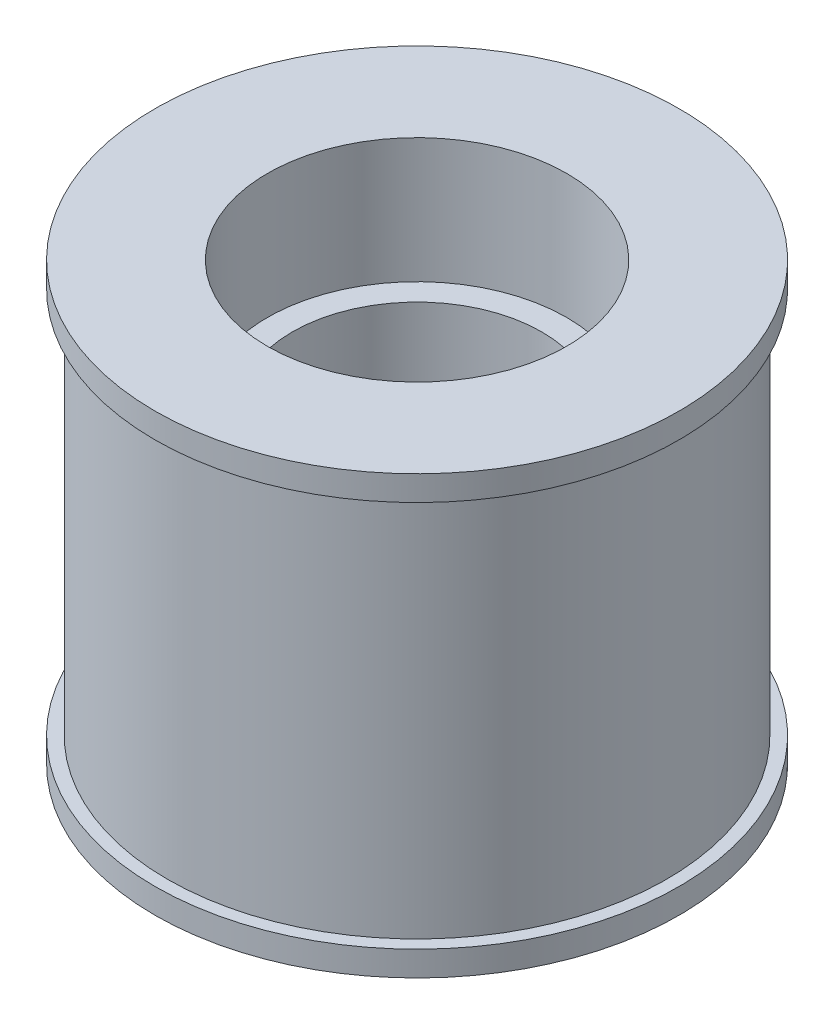
ISO-10303-21;
HEADER;
FILE_DESCRIPTION(('STEP AP214'),'2;1');
FILE_NAME('part.step','',(''),(''),'','','');
FILE_SCHEMA(('AUTOMOTIVE_DESIGN { 1 0 10303 214 1 1 1 1 }'));
ENDSEC;
DATA;
#1=APPLICATION_CONTEXT('core data for automotive mechanical design processes');
#2=APPLICATION_PROTOCOL_DEFINITION('international standard','automotive_design',2000,#1);
#3=PRODUCT_CONTEXT('',#1,'mechanical');
#4=PRODUCT('Part','Part','',(#3));
#5=PRODUCT_RELATED_PRODUCT_CATEGORY('part','',(#4));
#6=PRODUCT_DEFINITION_FORMATION('','',#4);
#7=PRODUCT_DEFINITION_CONTEXT('part definition',#1,'design');
#8=PRODUCT_DEFINITION('design','',#6,#7);
#9=PRODUCT_DEFINITION_SHAPE('','',#8);
#10=(LENGTH_UNIT() NAMED_UNIT(*) SI_UNIT(.MILLI.,.METRE.));
#11=(NAMED_UNIT(*) PLANE_ANGLE_UNIT() SI_UNIT($,.RADIAN.));
#12=(NAMED_UNIT(*) SI_UNIT($,.STERADIAN.) SOLID_ANGLE_UNIT());
#13=UNCERTAINTY_MEASURE_WITH_UNIT(LENGTH_MEASURE(1.E-05),#10,'distance_accuracy_value','');
#14=(GEOMETRIC_REPRESENTATION_CONTEXT(3) GLOBAL_UNCERTAINTY_ASSIGNED_CONTEXT((#13)) GLOBAL_UNIT_ASSIGNED_CONTEXT((#10,
#11,#12)) REPRESENTATION_CONTEXT('',''));
#15=CARTESIAN_POINT('',(0.,0.,0.));
#16=DIRECTION('',(0.,0.,1.));
#17=DIRECTION('',(1.,0.,0.));
#18=AXIS2_PLACEMENT_3D('',#15,#16,#17);
#19=CARTESIAN_POINT('',(0.,-35.,0.));
#20=DIRECTION('',(0.,1.,0.));
#21=DIRECTION('',(0.,0.,1.));
#22=AXIS2_PLACEMENT_3D('',#19,#20,#21);
#23=PLANE('',#22);
#24=CARTESIAN_POINT('',(0.,-35.,0.));
#25=DIRECTION('',(0.,1.,0.));
#26=DIRECTION('',(0.,0.,1.));
#27=AXIS2_PLACEMENT_3D('',#24,#25,#26);
#28=CIRCLE('',#27,42.);
#29=CARTESIAN_POINT('',(0.,-35.,42.));
#30=VERTEX_POINT('',#29);
#31=EDGE_CURVE('E41',#30,#30,#28,.T.);
#32=ORIENTED_EDGE('',*,*,#31,.F.);
#33=EDGE_LOOP('',(#32));
#34=FACE_BOUND('',#33,.T.);
#35=CARTESIAN_POINT('',(0.,-35.,0.));
#36=DIRECTION('',(0.,1.,0.));
#37=DIRECTION('',(0.,0.,1.));
#38=AXIS2_PLACEMENT_3D('',#35,#36,#37);
#39=CIRCLE('',#38,24.);
#40=CARTESIAN_POINT('',(0.,-35.,24.));
#41=VERTEX_POINT('',#40);
#42=EDGE_CURVE('E68',#41,#41,#39,.T.);
#43=ORIENTED_EDGE('',*,*,#42,.T.);
#44=EDGE_LOOP('',(#43));
#45=FACE_BOUND('',#44,.T.);
#46=ADVANCED_FACE('F33',(#34,#45),#23,.F.);
#47=CARTESIAN_POINT('',(0.,-35.,0.));
#48=DIRECTION('',(0.,1.,0.));
#49=DIRECTION('',(0.,0.,1.));
#50=AXIS2_PLACEMENT_3D('',#47,#48,#49);
#51=CYLINDRICAL_SURFACE('',#50,20.);
#52=CARTESIAN_POINT('',(0.,15.,0.));
#53=DIRECTION('',(0.,1.,0.));
#54=DIRECTION('',(0.,0.,1.));
#55=AXIS2_PLACEMENT_3D('',#52,#53,#54);
#56=CIRCLE('',#55,20.);
#57=CARTESIAN_POINT('',(0.,15.,20.));
#58=VERTEX_POINT('',#57);
#59=EDGE_CURVE('E63',#58,#58,#56,.T.);
#60=ORIENTED_EDGE('',*,*,#59,.T.);
#61=EDGE_LOOP('',(#60));
#62=FACE_BOUND('',#61,.T.);
#63=CARTESIAN_POINT('',(0.,-15.,0.));
#64=DIRECTION('',(0.,-1.,0.));
#65=DIRECTION('',(0.,0.,-1.));
#66=AXIS2_PLACEMENT_3D('',#63,#64,#65);
#67=CIRCLE('',#66,20.);
#68=CARTESIAN_POINT('',(0.,-15.,-20.));
#69=VERTEX_POINT('',#68);
#70=EDGE_CURVE('E37',#69,#69,#67,.F.);
#71=ORIENTED_EDGE('',*,*,#70,.F.);
#72=EDGE_LOOP('',(#71));
#73=FACE_BOUND('',#72,.T.);
#74=ADVANCED_FACE('F80',(#62,#73),#51,.F.);
#75=CARTESIAN_POINT('',(0.,35.,0.));
#76=DIRECTION('',(0.,-1.,0.));
#77=DIRECTION('',(0.,0.,-1.));
#78=AXIS2_PLACEMENT_3D('',#75,#76,#77);
#79=CYLINDRICAL_SURFACE('',#78,42.);
#80=CARTESIAN_POINT('',(0.,35.,0.));
#81=DIRECTION('',(0.,1.,0.));
#82=DIRECTION('',(0.,0.,1.));
#83=AXIS2_PLACEMENT_3D('',#80,#81,#82);
#84=CIRCLE('',#83,42.);
#85=CARTESIAN_POINT('',(0.,35.,42.));
#86=VERTEX_POINT('',#85);
#87=EDGE_CURVE('E10',#86,#86,#84,.T.);
#88=ORIENTED_EDGE('',*,*,#87,.F.);
#89=EDGE_LOOP('',(#88));
#90=FACE_BOUND('',#89,.T.);
#91=CARTESIAN_POINT('',(0.,31.,0.));
#92=DIRECTION('',(0.,1.,0.));
#93=DIRECTION('',(0.,0.,1.));
#94=AXIS2_PLACEMENT_3D('',#91,#92,#93);
#95=CIRCLE('',#94,42.);
#96=CARTESIAN_POINT('',(0.,31.,42.));
#97=VERTEX_POINT('',#96);
#98=EDGE_CURVE('E46',#97,#97,#95,.T.);
#99=ORIENTED_EDGE('',*,*,#98,.T.);
#100=EDGE_LOOP('',(#99));
#101=FACE_BOUND('',#100,.T.);
#102=ADVANCED_FACE('F35',(#90,#101),#79,.T.);
#103=CARTESIAN_POINT('',(0.,35.,0.));
#104=DIRECTION('',(0.,1.,0.));
#105=DIRECTION('',(0.,0.,1.));
#106=AXIS2_PLACEMENT_3D('',#103,#104,#105);
#107=PLANE('',#106);
#108=CARTESIAN_POINT('',(0.,35.,0.));
#109=DIRECTION('',(0.,1.,0.));
#110=DIRECTION('',(0.,0.,1.));
#111=AXIS2_PLACEMENT_3D('',#108,#109,#110);
#112=CIRCLE('',#111,24.);
#113=CARTESIAN_POINT('',(0.,35.,24.));
#114=VERTEX_POINT('',#113);
#115=EDGE_CURVE('E60',#114,#114,#112,.T.);
#116=ORIENTED_EDGE('',*,*,#115,.F.);
#117=EDGE_LOOP('',(#116));
#118=FACE_BOUND('',#117,.T.);
#119=ORIENTED_EDGE('',*,*,#87,.T.);
#120=EDGE_LOOP('',(#119));
#121=FACE_BOUND('',#120,.T.);
#122=ADVANCED_FACE('F88',(#118,#121),#107,.T.);
#123=CARTESIAN_POINT('',(42.,31.,0.));
#124=DIRECTION('',(0.,-1.,0.));
#125=DIRECTION('',(0.,0.,-1.));
#126=AXIS2_PLACEMENT_3D('',#123,#124,#125);
#127=PLANE('',#126);
#128=CARTESIAN_POINT('',(0.,31.,0.));
#129=DIRECTION('',(0.,1.,0.));
#130=DIRECTION('',(0.,0.,1.));
#131=AXIS2_PLACEMENT_3D('',#128,#129,#130);
#132=CIRCLE('',#131,40.);
#133=CARTESIAN_POINT('',(0.,31.,40.));
#134=VERTEX_POINT('',#133);
#135=EDGE_CURVE('E50',#134,#134,#132,.T.);
#136=ORIENTED_EDGE('',*,*,#135,.T.);
#137=EDGE_LOOP('',(#136));
#138=FACE_BOUND('',#137,.T.);
#139=ORIENTED_EDGE('',*,*,#98,.F.);
#140=EDGE_LOOP('',(#139));
#141=FACE_BOUND('',#140,.T.);
#142=ADVANCED_FACE('F111',(#138,#141),#127,.T.);
#143=CARTESIAN_POINT('',(0.,35.,0.));
#144=DIRECTION('',(0.,1.,0.));
#145=DIRECTION('',(0.,0.,1.));
#146=AXIS2_PLACEMENT_3D('',#143,#144,#145);
#147=CYLINDRICAL_SURFACE('',#146,40.);
#148=CARTESIAN_POINT('',(0.,-31.,0.));
#149=DIRECTION('',(0.,1.,0.));
#150=DIRECTION('',(0.,0.,1.));
#151=AXIS2_PLACEMENT_3D('',#148,#149,#150);
#152=CIRCLE('',#151,40.);
#153=CARTESIAN_POINT('',(0.,-31.,40.));
#154=VERTEX_POINT('',#153);
#155=EDGE_CURVE('E53',#154,#154,#152,.T.);
#156=ORIENTED_EDGE('',*,*,#155,.T.);
#157=EDGE_LOOP('',(#156));
#158=FACE_BOUND('',#157,.T.);
#159=ORIENTED_EDGE('',*,*,#135,.F.);
#160=EDGE_LOOP('',(#159));
#161=FACE_BOUND('',#160,.T.);
#162=ADVANCED_FACE('F107',(#158,#161),#147,.T.);
#163=CARTESIAN_POINT('',(40.,-31.,0.));
#164=DIRECTION('',(0.,1.,0.));
#165=DIRECTION('',(0.,0.,1.));
#166=AXIS2_PLACEMENT_3D('',#163,#164,#165);
#167=PLANE('',#166);
#168=CARTESIAN_POINT('',(0.,-31.,0.));
#169=DIRECTION('',(0.,1.,0.));
#170=DIRECTION('',(0.,0.,1.));
#171=AXIS2_PLACEMENT_3D('',#168,#169,#170);
#172=CIRCLE('',#171,42.);
#173=CARTESIAN_POINT('',(0.,-31.,42.));
#174=VERTEX_POINT('',#173);
#175=EDGE_CURVE('E56',#174,#174,#172,.T.);
#176=ORIENTED_EDGE('',*,*,#175,.T.);
#177=EDGE_LOOP('',(#176));
#178=FACE_BOUND('',#177,.T.);
#179=ORIENTED_EDGE('',*,*,#155,.F.);
#180=EDGE_LOOP('',(#179));
#181=FACE_BOUND('',#180,.T.);
#182=ADVANCED_FACE('F104',(#178,#181),#167,.T.);
#183=ORIENTED_EDGE('',*,*,#31,.T.);
#184=EDGE_LOOP('',(#183));
#185=FACE_BOUND('',#184,.T.);
#186=ORIENTED_EDGE('',*,*,#175,.F.);
#187=EDGE_LOOP('',(#186));
#188=FACE_BOUND('',#187,.T.);
#189=ADVANCED_FACE('F90',(#185,#188),#79,.T.);
#190=CARTESIAN_POINT('',(0.,15.,0.));
#191=DIRECTION('',(0.,1.,0.));
#192=DIRECTION('',(0.,0.,1.));
#193=AXIS2_PLACEMENT_3D('',#190,#191,#192);
#194=CYLINDRICAL_SURFACE('',#193,24.);
#195=CARTESIAN_POINT('',(0.,15.,0.));
#196=DIRECTION('',(0.,1.,0.));
#197=DIRECTION('',(0.,0.,1.));
#198=AXIS2_PLACEMENT_3D('',#195,#196,#197);
#199=CIRCLE('',#198,24.);
#200=CARTESIAN_POINT('',(0.,15.,24.));
#201=VERTEX_POINT('',#200);
#202=EDGE_CURVE('E59',#201,#201,#199,.T.);
#203=ORIENTED_EDGE('',*,*,#202,.F.);
#204=EDGE_LOOP('',(#203));
#205=FACE_BOUND('',#204,.T.);
#206=ORIENTED_EDGE('',*,*,#115,.T.);
#207=EDGE_LOOP('',(#206));
#208=FACE_BOUND('',#207,.T.);
#209=ADVANCED_FACE('F99',(#205,#208),#194,.F.);
#210=CARTESIAN_POINT('',(0.,15.,0.));
#211=DIRECTION('',(0.,1.,0.));
#212=DIRECTION('',(0.,0.,1.));
#213=AXIS2_PLACEMENT_3D('',#210,#211,#212);
#214=PLANE('',#213);
#215=ORIENTED_EDGE('',*,*,#59,.F.);
#216=EDGE_LOOP('',(#215));
#217=FACE_BOUND('',#216,.T.);
#218=ORIENTED_EDGE('',*,*,#202,.T.);
#219=EDGE_LOOP('',(#218));
#220=FACE_BOUND('',#219,.T.);
#221=ADVANCED_FACE('F96',(#217,#220),#214,.T.);
#222=CARTESIAN_POINT('',(0.,-15.,0.));
#223=DIRECTION('',(0.,-1.,0.));
#224=DIRECTION('',(0.,0.,1.));
#225=AXIS2_PLACEMENT_3D('',#222,#223,#224);
#226=PLANE('',#225);
#227=CARTESIAN_POINT('',(0.,-15.,0.));
#228=DIRECTION('',(0.,1.,0.));
#229=DIRECTION('',(0.,0.,1.));
#230=AXIS2_PLACEMENT_3D('',#227,#228,#229);
#231=CIRCLE('',#230,24.);
#232=CARTESIAN_POINT('',(0.,-15.,24.));
#233=VERTEX_POINT('',#232);
#234=EDGE_CURVE('E71',#233,#233,#231,.T.);
#235=ORIENTED_EDGE('',*,*,#234,.F.);
#236=EDGE_LOOP('',(#235));
#237=FACE_BOUND('',#236,.T.);
#238=ORIENTED_EDGE('',*,*,#70,.T.);
#239=EDGE_LOOP('',(#238));
#240=FACE_BOUND('',#239,.T.);
#241=ADVANCED_FACE('F78',(#237,#240),#226,.T.);
#242=CARTESIAN_POINT('',(0.,-15.,0.));
#243=DIRECTION('',(0.,-1.,0.));
#244=DIRECTION('',(0.,0.,-1.));
#245=AXIS2_PLACEMENT_3D('',#242,#243,#244);
#246=CYLINDRICAL_SURFACE('',#245,24.);
#247=ORIENTED_EDGE('',*,*,#234,.T.);
#248=EDGE_LOOP('',(#247));
#249=FACE_BOUND('',#248,.T.);
#250=ORIENTED_EDGE('',*,*,#42,.F.);
#251=EDGE_LOOP('',(#250));
#252=FACE_BOUND('',#251,.T.);
#253=ADVANCED_FACE('F94',(#249,#252),#246,.F.);
#254=CLOSED_SHELL('',(#46,#74,#102,#122,#142,#162,#182,#189,#209,#221,#241,#253));
#255=MANIFOLD_SOLID_BREP('B2',#254);
#256=ADVANCED_BREP_SHAPE_REPRESENTATION('',(#18,#255),#14);
#257=SHAPE_DEFINITION_REPRESENTATION(#9,#256);
ENDSEC;
END-ISO-10303-21;
